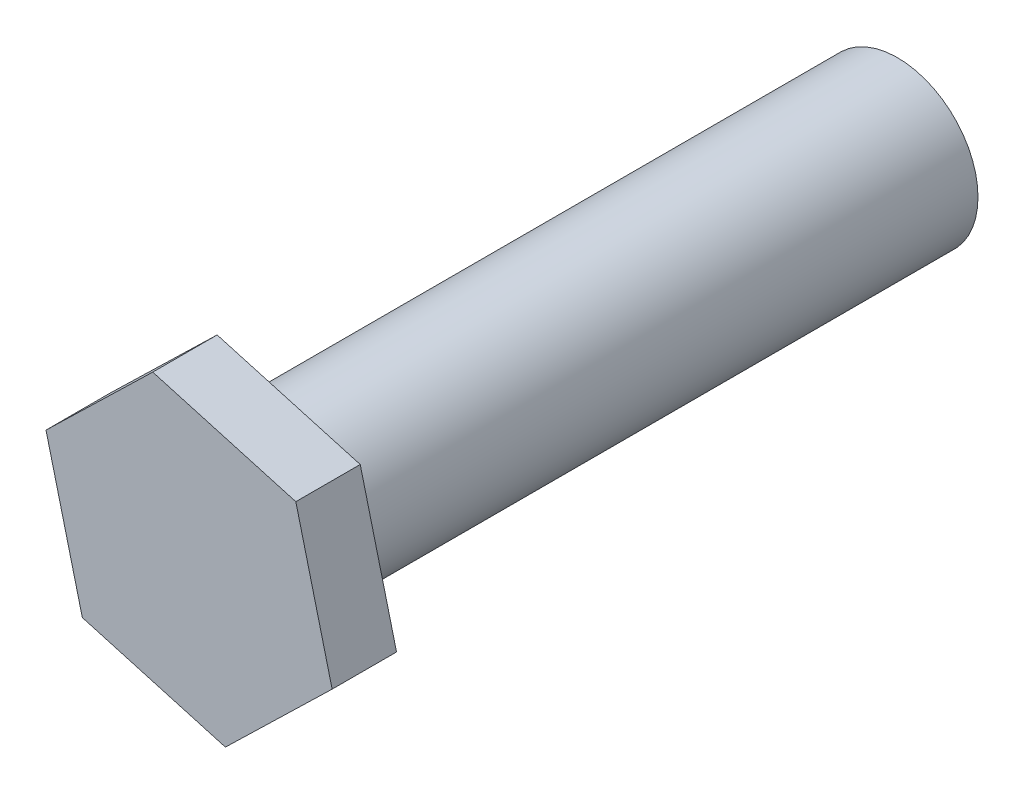
ISO-10303-21;
HEADER;
FILE_DESCRIPTION(('STEP AP214'),'2;1');
FILE_NAME('part.step','',(''),(''),'','','');
FILE_SCHEMA(('AUTOMOTIVE_DESIGN { 1 0 10303 214 1 1 1 1 }'));
ENDSEC;
DATA;
#1=APPLICATION_CONTEXT('core data for automotive mechanical design processes');
#2=APPLICATION_PROTOCOL_DEFINITION('international standard','automotive_design',2000,#1);
#3=PRODUCT_CONTEXT('',#1,'mechanical');
#4=PRODUCT('Part','Part','',(#3));
#5=PRODUCT_RELATED_PRODUCT_CATEGORY('part','',(#4));
#6=PRODUCT_DEFINITION_FORMATION('','',#4);
#7=PRODUCT_DEFINITION_CONTEXT('part definition',#1,'design');
#8=PRODUCT_DEFINITION('design','',#6,#7);
#9=PRODUCT_DEFINITION_SHAPE('','',#8);
#10=(LENGTH_UNIT() NAMED_UNIT(*) SI_UNIT(.MILLI.,.METRE.));
#11=(NAMED_UNIT(*) PLANE_ANGLE_UNIT() SI_UNIT($,.RADIAN.));
#12=(NAMED_UNIT(*) SI_UNIT($,.STERADIAN.) SOLID_ANGLE_UNIT());
#13=UNCERTAINTY_MEASURE_WITH_UNIT(LENGTH_MEASURE(1.E-05),#10,'distance_accuracy_value','');
#14=(GEOMETRIC_REPRESENTATION_CONTEXT(3) GLOBAL_UNCERTAINTY_ASSIGNED_CONTEXT((#13)) GLOBAL_UNIT_ASSIGNED_CONTEXT((#10,
#11,#12)) REPRESENTATION_CONTEXT('',''));
#15=CARTESIAN_POINT('',(0.,0.,0.));
#16=DIRECTION('',(0.,0.,1.));
#17=DIRECTION('',(1.,0.,0.));
#18=AXIS2_PLACEMENT_3D('',#15,#16,#17);
#19=CARTESIAN_POINT('',(0.,0.,20.));
#20=DIRECTION('',(0.,0.,-1.));
#21=DIRECTION('',(-1.,0.,0.));
#22=AXIS2_PLACEMENT_3D('',#19,#20,#21);
#23=CYLINDRICAL_SURFACE('',#22,2.5);
#24=CARTESIAN_POINT('',(0.,0.,20.));
#25=DIRECTION('',(0.,0.,1.));
#26=DIRECTION('',(1.,0.,0.));
#27=AXIS2_PLACEMENT_3D('',#24,#25,#26);
#28=CIRCLE('',#27,2.5);
#29=CARTESIAN_POINT('',(2.5,0.,20.));
#30=VERTEX_POINT('',#29);
#31=EDGE_CURVE('E11',#30,#30,#28,.T.);
#32=ORIENTED_EDGE('',*,*,#31,.F.);
#33=EDGE_LOOP('',(#32));
#34=FACE_BOUND('',#33,.T.);
#35=CARTESIAN_POINT('',(0.,0.,0.));
#36=DIRECTION('',(0.,0.,1.));
#37=DIRECTION('',(1.,0.,0.));
#38=AXIS2_PLACEMENT_3D('',#35,#36,#37);
#39=CIRCLE('',#38,2.5);
#40=CARTESIAN_POINT('',(2.5,0.,0.));
#41=VERTEX_POINT('',#40);
#42=EDGE_CURVE('E38',#41,#41,#39,.T.);
#43=ORIENTED_EDGE('',*,*,#42,.T.);
#44=EDGE_LOOP('',(#43));
#45=FACE_BOUND('',#44,.T.);
#46=ADVANCED_FACE('F35',(#34,#45),#23,.T.);
#47=CARTESIAN_POINT('',(0.,0.,0.));
#48=DIRECTION('',(0.,0.,1.));
#49=DIRECTION('',(1.,0.,0.));
#50=AXIS2_PLACEMENT_3D('',#47,#48,#49);
#51=PLANE('',#50);
#52=ORIENTED_EDGE('',*,*,#42,.F.);
#53=EDGE_LOOP('',(#52));
#54=FACE_BOUND('',#53,.T.);
#55=ADVANCED_FACE('F143',(#54),#51,.F.);
#56=CARTESIAN_POINT('',(0.,0.,20.));
#57=DIRECTION('',(0.,0.,1.));
#58=DIRECTION('',(1.,0.,0.));
#59=AXIS2_PLACEMENT_3D('',#56,#57,#58);
#60=PLANE('',#59);
#61=DIRECTION('',(-0.244196942198812,0.969725658844165,0.));
#62=VECTOR('',#61,1.);
#63=CARTESIAN_POINT('',(4.44285131663173,-1.26269771189982,20.));
#64=LINE('',#63,#62);
#65=CARTESIAN_POINT('',(4.44285131663173,-1.26269771189982,20.));
#66=VERTEX_POINT('',#65);
#67=CARTESIAN_POINT('',(3.31495395412159,3.21627324949031,20.));
#68=VERTEX_POINT('',#67);
#69=EDGE_CURVE('E120',#66,#68,#64,.T.);
#70=ORIENTED_EDGE('',*,*,#69,.F.);
#71=DIRECTION('',(0.717708584161243,0.696343584892734,0.));
#72=VECTOR('',#71,1.);
#73=CARTESIAN_POINT('',(1.12789736251014,-4.47897096139013,20.));
#74=LINE('',#73,#72);
#75=CARTESIAN_POINT('',(1.12789736251014,-4.47897096139013,20.));
#76=VERTEX_POINT('',#75);
#77=EDGE_CURVE('E80',#76,#66,#74,.T.);
#78=ORIENTED_EDGE('',*,*,#77,.F.);
#79=DIRECTION('',(0.961905526360055,-0.273382073951432,0.));
#80=VECTOR('',#79,1.);
#81=CARTESIAN_POINT('',(-3.31495395412159,-3.21627324949031,20.));
#82=LINE('',#81,#80);
#83=CARTESIAN_POINT('',(-3.31495395412159,-3.21627324949031,20.));
#84=VERTEX_POINT('',#83);
#85=EDGE_CURVE('E74',#84,#76,#82,.T.);
#86=ORIENTED_EDGE('',*,*,#85,.F.);
#87=DIRECTION('',(0.244196942198812,-0.969725658844165,0.));
#88=VECTOR('',#87,1.);
#89=CARTESIAN_POINT('',(-4.44285131663173,1.26269771189982,20.));
#90=LINE('',#89,#88);
#91=CARTESIAN_POINT('',(-4.44285131663173,1.26269771189982,20.));
#92=VERTEX_POINT('',#91);
#93=EDGE_CURVE('E110',#92,#84,#90,.T.);
#94=ORIENTED_EDGE('',*,*,#93,.F.);
#95=DIRECTION('',(-0.717708584161243,-0.696343584892734,0.));
#96=VECTOR('',#95,1.);
#97=CARTESIAN_POINT('',(-1.12789736251014,4.47897096139013,20.));
#98=LINE('',#97,#96);
#99=CARTESIAN_POINT('',(-1.12789736251014,4.47897096139013,20.));
#100=VERTEX_POINT('',#99);
#101=EDGE_CURVE('E125',#100,#92,#98,.T.);
#102=ORIENTED_EDGE('',*,*,#101,.F.);
#103=DIRECTION('',(-0.961905526360055,0.273382073951432,0.));
#104=VECTOR('',#103,1.);
#105=CARTESIAN_POINT('',(3.31495395412159,3.21627324949031,20.));
#106=LINE('',#105,#104);
#107=EDGE_CURVE('E123',#68,#100,#106,.T.);
#108=ORIENTED_EDGE('',*,*,#107,.F.);
#109=EDGE_LOOP('',(#70,#78,#86,#94,#102,#108));
#110=FACE_BOUND('',#109,.T.);
#111=ORIENTED_EDGE('',*,*,#31,.T.);
#112=EDGE_LOOP('',(#111));
#113=FACE_BOUND('',#112,.T.);
#114=ADVANCED_FACE('F145',(#110,#113),#60,.F.);
#115=CARTESIAN_POINT('',(4.44285131663173,-1.26269771189982,22.));
#116=DIRECTION('',(-0.969725658844165,-0.244196942198812,0.));
#117=DIRECTION('',(0.244196942198812,-0.969725658844165,0.));
#118=AXIS2_PLACEMENT_3D('',#115,#116,#117);
#119=PLANE('',#118);
#120=ORIENTED_EDGE('',*,*,#69,.T.);
#121=DIRECTION('',(0.,0.,-1.));
#122=VECTOR('',#121,1.);
#123=CARTESIAN_POINT('',(3.31495395412159,3.21627324949031,22.));
#124=LINE('',#123,#122);
#125=CARTESIAN_POINT('',(3.31495395412159,3.21627324949031,22.));
#126=VERTEX_POINT('',#125);
#127=EDGE_CURVE('E137',#126,#68,#124,.T.);
#128=ORIENTED_EDGE('',*,*,#127,.F.);
#129=DIRECTION('',(-0.244196942198812,0.969725658844165,0.));
#130=VECTOR('',#129,1.);
#131=CARTESIAN_POINT('',(4.44285131663173,-1.26269771189982,22.));
#132=LINE('',#131,#130);
#133=CARTESIAN_POINT('',(4.44285131663173,-1.26269771189982,22.));
#134=VERTEX_POINT('',#133);
#135=EDGE_CURVE('E130',#134,#126,#132,.T.);
#136=ORIENTED_EDGE('',*,*,#135,.F.);
#137=DIRECTION('',(0.,0.,-1.));
#138=VECTOR('',#137,1.);
#139=CARTESIAN_POINT('',(4.44285131663173,-1.26269771189982,22.));
#140=LINE('',#139,#138);
#141=EDGE_CURVE('E116',#134,#66,#140,.T.);
#142=ORIENTED_EDGE('',*,*,#141,.T.);
#143=EDGE_LOOP('',(#120,#128,#136,#142));
#144=FACE_BOUND('',#143,.T.);
#145=ADVANCED_FACE('F150',(#144),#119,.F.);
#146=CARTESIAN_POINT('',(3.31495395412159,3.21627324949031,22.));
#147=DIRECTION('',(-0.273382073951432,-0.961905526360055,0.));
#148=DIRECTION('',(0.961905526360055,-0.273382073951432,0.));
#149=AXIS2_PLACEMENT_3D('',#146,#147,#148);
#150=PLANE('',#149);
#151=ORIENTED_EDGE('',*,*,#107,.T.);
#152=DIRECTION('',(0.,0.,-1.));
#153=VECTOR('',#152,1.);
#154=CARTESIAN_POINT('',(-1.12789736251014,4.47897096139013,22.));
#155=LINE('',#154,#153);
#156=CARTESIAN_POINT('',(-1.12789736251014,4.47897096139013,22.));
#157=VERTEX_POINT('',#156);
#158=EDGE_CURVE('E134',#157,#100,#155,.T.);
#159=ORIENTED_EDGE('',*,*,#158,.F.);
#160=DIRECTION('',(-0.961905526360055,0.273382073951432,0.));
#161=VECTOR('',#160,1.);
#162=CARTESIAN_POINT('',(3.31495395412159,3.21627324949031,22.));
#163=LINE('',#162,#161);
#164=EDGE_CURVE('E89',#126,#157,#163,.T.);
#165=ORIENTED_EDGE('',*,*,#164,.F.);
#166=ORIENTED_EDGE('',*,*,#127,.T.);
#167=EDGE_LOOP('',(#151,#159,#165,#166));
#168=FACE_BOUND('',#167,.T.);
#169=ADVANCED_FACE('F157',(#168),#150,.F.);
#170=CARTESIAN_POINT('',(-1.12789736251014,4.47897096139013,22.));
#171=DIRECTION('',(0.696343584892734,-0.717708584161243,0.));
#172=DIRECTION('',(0.717708584161243,0.696343584892734,0.));
#173=AXIS2_PLACEMENT_3D('',#170,#171,#172);
#174=PLANE('',#173);
#175=ORIENTED_EDGE('',*,*,#101,.T.);
#176=DIRECTION('',(0.,0.,-1.));
#177=VECTOR('',#176,1.);
#178=CARTESIAN_POINT('',(-4.44285131663173,1.26269771189982,22.));
#179=LINE('',#178,#177);
#180=CARTESIAN_POINT('',(-4.44285131663173,1.26269771189982,22.));
#181=VERTEX_POINT('',#180);
#182=EDGE_CURVE('E111',#181,#92,#179,.T.);
#183=ORIENTED_EDGE('',*,*,#182,.F.);
#184=DIRECTION('',(-0.717708584161243,-0.696343584892734,0.));
#185=VECTOR('',#184,1.);
#186=CARTESIAN_POINT('',(-1.12789736251014,4.47897096139013,22.));
#187=LINE('',#186,#185);
#188=EDGE_CURVE('E102',#157,#181,#187,.T.);
#189=ORIENTED_EDGE('',*,*,#188,.F.);
#190=ORIENTED_EDGE('',*,*,#158,.T.);
#191=EDGE_LOOP('',(#175,#183,#189,#190));
#192=FACE_BOUND('',#191,.T.);
#193=ADVANCED_FACE('F161',(#192),#174,.F.);
#194=CARTESIAN_POINT('',(-4.44285131663173,1.26269771189982,22.));
#195=DIRECTION('',(0.969725658844165,0.244196942198812,0.));
#196=DIRECTION('',(-0.244196942198812,0.969725658844165,0.));
#197=AXIS2_PLACEMENT_3D('',#194,#195,#196);
#198=PLANE('',#197);
#199=ORIENTED_EDGE('',*,*,#93,.T.);
#200=DIRECTION('',(0.,0.,-1.));
#201=VECTOR('',#200,1.);
#202=CARTESIAN_POINT('',(-3.31495395412159,-3.21627324949031,22.));
#203=LINE('',#202,#201);
#204=CARTESIAN_POINT('',(-3.31495395412159,-3.21627324949031,22.));
#205=VERTEX_POINT('',#204);
#206=EDGE_CURVE('E107',#205,#84,#203,.T.);
#207=ORIENTED_EDGE('',*,*,#206,.F.);
#208=DIRECTION('',(0.244196942198812,-0.969725658844165,0.));
#209=VECTOR('',#208,1.);
#210=CARTESIAN_POINT('',(-4.44285131663173,1.26269771189982,22.));
#211=LINE('',#210,#209);
#212=EDGE_CURVE('E96',#181,#205,#211,.T.);
#213=ORIENTED_EDGE('',*,*,#212,.F.);
#214=ORIENTED_EDGE('',*,*,#182,.T.);
#215=EDGE_LOOP('',(#199,#207,#213,#214));
#216=FACE_BOUND('',#215,.T.);
#217=ADVANCED_FACE('F108',(#216),#198,.F.);
#218=CARTESIAN_POINT('',(-3.31495395412159,-3.21627324949031,22.));
#219=DIRECTION('',(0.273382073951432,0.961905526360055,0.));
#220=DIRECTION('',(-0.961905526360055,0.273382073951432,0.));
#221=AXIS2_PLACEMENT_3D('',#218,#219,#220);
#222=PLANE('',#221);
#223=ORIENTED_EDGE('',*,*,#85,.T.);
#224=DIRECTION('',(0.,0.,-1.));
#225=VECTOR('',#224,1.);
#226=CARTESIAN_POINT('',(1.12789736251014,-4.47897096139013,22.));
#227=LINE('',#226,#225);
#228=CARTESIAN_POINT('',(1.12789736251014,-4.47897096139013,22.));
#229=VERTEX_POINT('',#228);
#230=EDGE_CURVE('E112',#229,#76,#227,.T.);
#231=ORIENTED_EDGE('',*,*,#230,.F.);
#232=DIRECTION('',(0.961905526360055,-0.273382073951432,0.));
#233=VECTOR('',#232,1.);
#234=CARTESIAN_POINT('',(-3.31495395412159,-3.21627324949031,22.));
#235=LINE('',#234,#233);
#236=EDGE_CURVE('E100',#205,#229,#235,.T.);
#237=ORIENTED_EDGE('',*,*,#236,.F.);
#238=ORIENTED_EDGE('',*,*,#206,.T.);
#239=EDGE_LOOP('',(#223,#231,#237,#238));
#240=FACE_BOUND('',#239,.T.);
#241=ADVANCED_FACE('F114',(#240),#222,.F.);
#242=CARTESIAN_POINT('',(1.12789736251014,-4.47897096139013,22.));
#243=DIRECTION('',(-0.696343584892734,0.717708584161243,0.));
#244=DIRECTION('',(-0.717708584161243,-0.696343584892734,0.));
#245=AXIS2_PLACEMENT_3D('',#242,#243,#244);
#246=PLANE('',#245);
#247=ORIENTED_EDGE('',*,*,#77,.T.);
#248=ORIENTED_EDGE('',*,*,#141,.F.);
#249=DIRECTION('',(0.717708584161243,0.696343584892734,0.));
#250=VECTOR('',#249,1.);
#251=CARTESIAN_POINT('',(1.12789736251014,-4.47897096139013,22.));
#252=LINE('',#251,#250);
#253=EDGE_CURVE('E51',#229,#134,#252,.T.);
#254=ORIENTED_EDGE('',*,*,#253,.F.);
#255=ORIENTED_EDGE('',*,*,#230,.T.);
#256=EDGE_LOOP('',(#247,#248,#254,#255));
#257=FACE_BOUND('',#256,.T.);
#258=ADVANCED_FACE('F169',(#257),#246,.F.);
#259=CARTESIAN_POINT('',(0.,0.,22.));
#260=DIRECTION('',(0.,0.,1.));
#261=DIRECTION('',(1.,0.,0.));
#262=AXIS2_PLACEMENT_3D('',#259,#260,#261);
#263=PLANE('',#262);
#264=ORIENTED_EDGE('',*,*,#135,.T.);
#265=ORIENTED_EDGE('',*,*,#164,.T.);
#266=ORIENTED_EDGE('',*,*,#188,.T.);
#267=ORIENTED_EDGE('',*,*,#212,.T.);
#268=ORIENTED_EDGE('',*,*,#236,.T.);
#269=ORIENTED_EDGE('',*,*,#253,.T.);
#270=EDGE_LOOP('',(#264,#265,#266,#267,#268,#269));
#271=FACE_BOUND('',#270,.T.);
#272=ADVANCED_FACE('F98',(#271),#263,.T.);
#273=CLOSED_SHELL('',(#46,#55,#114,#145,#169,#193,#217,#241,#258,#272));
#274=MANIFOLD_SOLID_BREP('B2',#273);
#275=ADVANCED_BREP_SHAPE_REPRESENTATION('',(#18,#274),#14);
#276=SHAPE_DEFINITION_REPRESENTATION(#9,#275);
ENDSEC;
END-ISO-10303-21;
